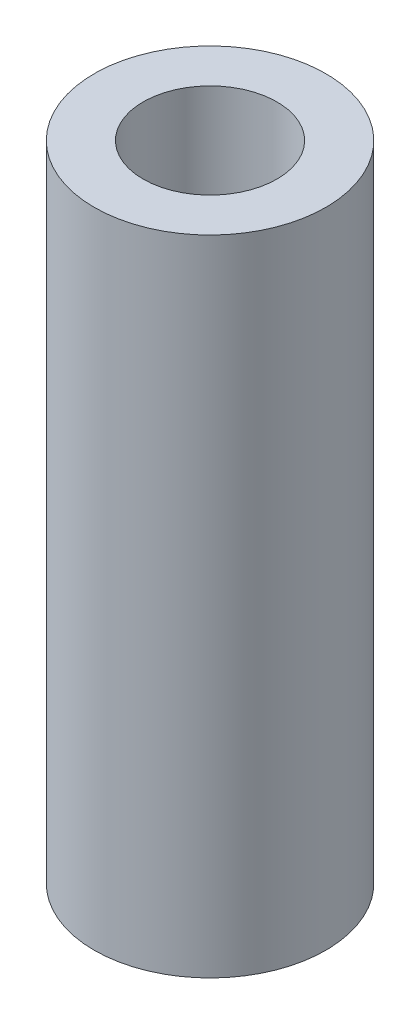
ISO-10303-21;
HEADER;
FILE_DESCRIPTION(('STEP AP214'),'2;1');
FILE_NAME('part.step','',(''),(''),'','','');
FILE_SCHEMA(('AUTOMOTIVE_DESIGN { 1 0 10303 214 1 1 1 1 }'));
ENDSEC;
DATA;
#1=APPLICATION_CONTEXT('core data for automotive mechanical design processes');
#2=APPLICATION_PROTOCOL_DEFINITION('international standard','automotive_design',2000,#1);
#3=PRODUCT_CONTEXT('',#1,'mechanical');
#4=PRODUCT('Part','Part','',(#3));
#5=PRODUCT_RELATED_PRODUCT_CATEGORY('part','',(#4));
#6=PRODUCT_DEFINITION_FORMATION('','',#4);
#7=PRODUCT_DEFINITION_CONTEXT('part definition',#1,'design');
#8=PRODUCT_DEFINITION('design','',#6,#7);
#9=PRODUCT_DEFINITION_SHAPE('','',#8);
#10=(LENGTH_UNIT() NAMED_UNIT(*) SI_UNIT(.MILLI.,.METRE.));
#11=(NAMED_UNIT(*) PLANE_ANGLE_UNIT() SI_UNIT($,.RADIAN.));
#12=(NAMED_UNIT(*) SI_UNIT($,.STERADIAN.) SOLID_ANGLE_UNIT());
#13=UNCERTAINTY_MEASURE_WITH_UNIT(LENGTH_MEASURE(1.E-05),#10,'distance_accuracy_value','');
#14=(GEOMETRIC_REPRESENTATION_CONTEXT(3) GLOBAL_UNCERTAINTY_ASSIGNED_CONTEXT((#13)) GLOBAL_UNIT_ASSIGNED_CONTEXT((#10,
#11,#12)) REPRESENTATION_CONTEXT('',''));
#15=CARTESIAN_POINT('',(0.,0.,0.));
#16=DIRECTION('',(0.,0.,1.));
#17=DIRECTION('',(1.,0.,0.));
#18=AXIS2_PLACEMENT_3D('',#15,#16,#17);
#19=CARTESIAN_POINT('',(0.,25.,0.));
#20=DIRECTION('',(0.,1.,0.));
#21=DIRECTION('',(0.,0.,1.));
#22=AXIS2_PLACEMENT_3D('',#19,#20,#21);
#23=PLANE('',#22);
#24=CARTESIAN_POINT('',(0.,25.,0.));
#25=DIRECTION('',(0.,1.,0.));
#26=DIRECTION('',(0.,0.,1.));
#27=AXIS2_PLACEMENT_3D('',#24,#25,#26);
#28=CIRCLE('',#27,4.5);
#29=CARTESIAN_POINT('',(0.,25.,4.5));
#30=VERTEX_POINT('',#29);
#31=EDGE_CURVE('E10',#30,#30,#28,.T.);
#32=ORIENTED_EDGE('',*,*,#31,.T.);
#33=EDGE_LOOP('',(#32));
#34=FACE_BOUND('',#33,.T.);
#35=CARTESIAN_POINT('',(0.,25.,0.));
#36=DIRECTION('',(0.,1.,0.));
#37=DIRECTION('',(0.,0.,1.));
#38=AXIS2_PLACEMENT_3D('',#35,#36,#37);
#39=CIRCLE('',#38,2.6);
#40=CARTESIAN_POINT('',(0.,25.,2.6));
#41=VERTEX_POINT('',#40);
#42=EDGE_CURVE('E45',#41,#41,#39,.T.);
#43=ORIENTED_EDGE('',*,*,#42,.F.);
#44=EDGE_LOOP('',(#43));
#45=FACE_BOUND('',#44,.T.);
#46=ADVANCED_FACE('F34',(#34,#45),#23,.T.);
#47=CARTESIAN_POINT('',(0.,0.,0.));
#48=DIRECTION('',(0.,1.,0.));
#49=DIRECTION('',(0.,0.,1.));
#50=AXIS2_PLACEMENT_3D('',#47,#48,#49);
#51=PLANE('',#50);
#52=CARTESIAN_POINT('',(0.,0.,0.));
#53=DIRECTION('',(0.,1.,0.));
#54=DIRECTION('',(0.,0.,1.));
#55=AXIS2_PLACEMENT_3D('',#52,#53,#54);
#56=CIRCLE('',#55,4.5);
#57=CARTESIAN_POINT('',(0.,0.,4.5));
#58=VERTEX_POINT('',#57);
#59=EDGE_CURVE('E38',#58,#58,#56,.T.);
#60=ORIENTED_EDGE('',*,*,#59,.F.);
#61=EDGE_LOOP('',(#60));
#62=FACE_BOUND('',#61,.T.);
#63=CARTESIAN_POINT('',(0.,0.,0.));
#64=DIRECTION('',(0.,1.,0.));
#65=DIRECTION('',(0.,0.,1.));
#66=AXIS2_PLACEMENT_3D('',#63,#64,#65);
#67=CIRCLE('',#66,2.6);
#68=CARTESIAN_POINT('',(0.,0.,2.6));
#69=VERTEX_POINT('',#68);
#70=EDGE_CURVE('E47',#69,#69,#67,.T.);
#71=ORIENTED_EDGE('',*,*,#70,.T.);
#72=EDGE_LOOP('',(#71));
#73=FACE_BOUND('',#72,.T.);
#74=ADVANCED_FACE('F57',(#62,#73),#51,.F.);
#75=CARTESIAN_POINT('',(0.,25.,0.));
#76=DIRECTION('',(0.,-1.,0.));
#77=DIRECTION('',(0.,0.,-1.));
#78=AXIS2_PLACEMENT_3D('',#75,#76,#77);
#79=CYLINDRICAL_SURFACE('',#78,4.5);
#80=ORIENTED_EDGE('',*,*,#31,.F.);
#81=EDGE_LOOP('',(#80));
#82=FACE_BOUND('',#81,.T.);
#83=ORIENTED_EDGE('',*,*,#59,.T.);
#84=EDGE_LOOP('',(#83));
#85=FACE_BOUND('',#84,.T.);
#86=ADVANCED_FACE('F36',(#82,#85),#79,.T.);
#87=CARTESIAN_POINT('',(0.,25.,0.));
#88=DIRECTION('',(0.,-1.,0.));
#89=DIRECTION('',(0.,0.,-1.));
#90=AXIS2_PLACEMENT_3D('',#87,#88,#89);
#91=CYLINDRICAL_SURFACE('',#90,2.6);
#92=ORIENTED_EDGE('',*,*,#42,.T.);
#93=EDGE_LOOP('',(#92));
#94=FACE_BOUND('',#93,.T.);
#95=ORIENTED_EDGE('',*,*,#70,.F.);
#96=EDGE_LOOP('',(#95));
#97=FACE_BOUND('',#96,.T.);
#98=ADVANCED_FACE('F53',(#94,#97),#91,.F.);
#99=CLOSED_SHELL('',(#46,#74,#86,#98));
#100=MANIFOLD_SOLID_BREP('B2',#99);
#101=ADVANCED_BREP_SHAPE_REPRESENTATION('',(#18,#100),#14);
#102=SHAPE_DEFINITION_REPRESENTATION(#9,#101);
ENDSEC;
END-ISO-10303-21;
